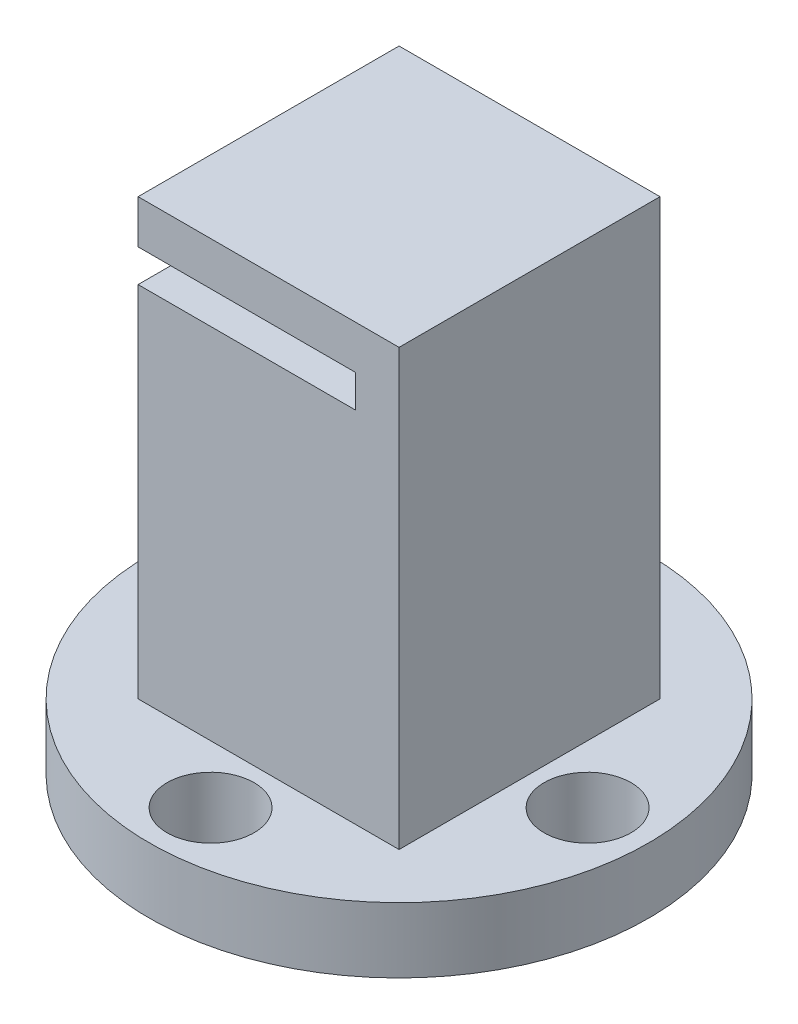
ISO-10303-21;
HEADER;
FILE_DESCRIPTION(('STEP AP214'),'2;1');
FILE_NAME('part.step','',(''),(''),'','','');
FILE_SCHEMA(('AUTOMOTIVE_DESIGN { 1 0 10303 214 1 1 1 1 }'));
ENDSEC;
DATA;
#1=APPLICATION_CONTEXT('core data for automotive mechanical design processes');
#2=APPLICATION_PROTOCOL_DEFINITION('international standard','automotive_design',2000,#1);
#3=PRODUCT_CONTEXT('',#1,'mechanical');
#4=PRODUCT('Part','Part','',(#3));
#5=PRODUCT_RELATED_PRODUCT_CATEGORY('part','',(#4));
#6=PRODUCT_DEFINITION_FORMATION('','',#4);
#7=PRODUCT_DEFINITION_CONTEXT('part definition',#1,'design');
#8=PRODUCT_DEFINITION('design','',#6,#7);
#9=PRODUCT_DEFINITION_SHAPE('','',#8);
#10=(LENGTH_UNIT() NAMED_UNIT(*) SI_UNIT(.MILLI.,.METRE.));
#11=(NAMED_UNIT(*) PLANE_ANGLE_UNIT() SI_UNIT($,.RADIAN.));
#12=(NAMED_UNIT(*) SI_UNIT($,.STERADIAN.) SOLID_ANGLE_UNIT());
#13=UNCERTAINTY_MEASURE_WITH_UNIT(LENGTH_MEASURE(1.E-05),#10,'distance_accuracy_value','');
#14=(GEOMETRIC_REPRESENTATION_CONTEXT(3) GLOBAL_UNCERTAINTY_ASSIGNED_CONTEXT((#13)) GLOBAL_UNIT_ASSIGNED_CONTEXT((#10,
#11,#12)) REPRESENTATION_CONTEXT('',''));
#15=CARTESIAN_POINT('',(0.,0.,0.));
#16=DIRECTION('',(0.,0.,1.));
#17=DIRECTION('',(1.,0.,0.));
#18=AXIS2_PLACEMENT_3D('',#15,#16,#17);
#19=CARTESIAN_POINT('',(0.,20.,0.));
#20=DIRECTION('',(1.,0.,0.));
#21=DIRECTION('',(0.,0.,-1.));
#22=AXIS2_PLACEMENT_3D('',#19,#20,#21);
#23=PLANE('',#22);
#24=DIRECTION('',(0.,-1.,0.));
#25=VECTOR('',#24,1.);
#26=CARTESIAN_POINT('',(0.,18.,-10.));
#27=LINE('',#26,#25);
#28=CARTESIAN_POINT('',(0.,18.,-10.));
#29=VERTEX_POINT('',#28);
#30=CARTESIAN_POINT('',(0.,16.5,-10.));
#31=VERTEX_POINT('',#30);
#32=EDGE_CURVE('E181',#29,#31,#27,.T.);
#33=ORIENTED_EDGE('',*,*,#32,.F.);
#34=DIRECTION('',(0.,0.,1.));
#35=VECTOR('',#34,1.);
#36=CARTESIAN_POINT('',(0.,18.,-10.));
#37=LINE('',#36,#35);
#38=CARTESIAN_POINT('',(0.,18.,0.));
#39=VERTEX_POINT('',#38);
#40=EDGE_CURVE('E87',#29,#39,#37,.T.);
#41=ORIENTED_EDGE('',*,*,#40,.T.);
#42=DIRECTION('',(0.,-1.,0.));
#43=VECTOR('',#42,1.);
#44=CARTESIAN_POINT('',(0.,20.,0.));
#45=LINE('',#44,#43);
#46=CARTESIAN_POINT('',(0.,20.,0.));
#47=VERTEX_POINT('',#46);
#48=EDGE_CURVE('E11',#47,#39,#45,.T.);
#49=ORIENTED_EDGE('',*,*,#48,.F.);
#50=DIRECTION('',(0.,0.,1.));
#51=VECTOR('',#50,1.);
#52=CARTESIAN_POINT('',(0.,20.,0.));
#53=LINE('',#52,#51);
#54=CARTESIAN_POINT('',(0.,20.,-12.));
#55=VERTEX_POINT('',#54);
#56=EDGE_CURVE('E111',#55,#47,#53,.T.);
#57=ORIENTED_EDGE('',*,*,#56,.F.);
#58=DIRECTION('',(0.,-1.,0.));
#59=VECTOR('',#58,1.);
#60=CARTESIAN_POINT('',(0.,20.,-12.));
#61=LINE('',#60,#59);
#62=CARTESIAN_POINT('',(0.,0.,-12.));
#63=VERTEX_POINT('',#62);
#64=EDGE_CURVE('E129',#55,#63,#61,.T.);
#65=ORIENTED_EDGE('',*,*,#64,.T.);
#66=DIRECTION('',(0.,0.,1.));
#67=VECTOR('',#66,1.);
#68=CARTESIAN_POINT('',(0.,0.,0.));
#69=LINE('',#68,#67);
#70=CARTESIAN_POINT('',(0.,0.,0.));
#71=VERTEX_POINT('',#70);
#72=EDGE_CURVE('E133',#63,#71,#69,.T.);
#73=ORIENTED_EDGE('',*,*,#72,.T.);
#74=CARTESIAN_POINT('',(0.,16.5,0.));
#75=VERTEX_POINT('',#74);
#76=EDGE_CURVE('E47',#75,#71,#45,.T.);
#77=ORIENTED_EDGE('',*,*,#76,.F.);
#78=DIRECTION('',(0.,0.,1.));
#79=VECTOR('',#78,1.);
#80=CARTESIAN_POINT('',(0.,16.5,-10.));
#81=LINE('',#80,#79);
#82=EDGE_CURVE('E54',#31,#75,#81,.T.);
#83=ORIENTED_EDGE('',*,*,#82,.F.);
#84=EDGE_LOOP('',(#33,#41,#49,#57,#65,#73,#77,#83));
#85=FACE_BOUND('',#84,.T.);
#86=ADVANCED_FACE('F39',(#85),#23,.F.);
#87=CARTESIAN_POINT('',(0.,20.,0.));
#88=DIRECTION('',(0.,0.,-1.));
#89=DIRECTION('',(-1.,0.,0.));
#90=AXIS2_PLACEMENT_3D('',#87,#88,#89);
#91=PLANE('',#90);
#92=ORIENTED_EDGE('',*,*,#48,.T.);
#93=DIRECTION('',(-1.,0.,0.));
#94=VECTOR('',#93,1.);
#95=CARTESIAN_POINT('',(0.,18.,0.));
#96=LINE('',#95,#94);
#97=CARTESIAN_POINT('',(10.,18.,0.));
#98=VERTEX_POINT('',#97);
#99=EDGE_CURVE('E185',#98,#39,#96,.T.);
#100=ORIENTED_EDGE('',*,*,#99,.F.);
#101=DIRECTION('',(0.,1.,0.));
#102=VECTOR('',#101,1.);
#103=CARTESIAN_POINT('',(10.,18.,0.));
#104=LINE('',#103,#102);
#105=CARTESIAN_POINT('',(10.,16.5,0.));
#106=VERTEX_POINT('',#105);
#107=EDGE_CURVE('E193',#106,#98,#104,.T.);
#108=ORIENTED_EDGE('',*,*,#107,.F.);
#109=DIRECTION('',(1.,0.,0.));
#110=VECTOR('',#109,1.);
#111=CARTESIAN_POINT('',(0.,16.5,0.));
#112=LINE('',#111,#110);
#113=EDGE_CURVE('E165',#75,#106,#112,.T.);
#114=ORIENTED_EDGE('',*,*,#113,.F.);
#115=ORIENTED_EDGE('',*,*,#76,.T.);
#116=DIRECTION('',(1.,0.,0.));
#117=VECTOR('',#116,1.);
#118=CARTESIAN_POINT('',(0.,0.,0.));
#119=LINE('',#118,#117);
#120=CARTESIAN_POINT('',(12.,0.,0.));
#121=VERTEX_POINT('',#120);
#122=EDGE_CURVE('E120',#71,#121,#119,.T.);
#123=ORIENTED_EDGE('',*,*,#122,.T.);
#124=DIRECTION('',(0.,-1.,0.));
#125=VECTOR('',#124,1.);
#126=CARTESIAN_POINT('',(12.,20.,0.));
#127=LINE('',#126,#125);
#128=CARTESIAN_POINT('',(12.,20.,0.));
#129=VERTEX_POINT('',#128);
#130=EDGE_CURVE('E117',#129,#121,#127,.T.);
#131=ORIENTED_EDGE('',*,*,#130,.F.);
#132=DIRECTION('',(1.,0.,0.));
#133=VECTOR('',#132,1.);
#134=CARTESIAN_POINT('',(0.,20.,0.));
#135=LINE('',#134,#133);
#136=EDGE_CURVE('E104',#47,#129,#135,.T.);
#137=ORIENTED_EDGE('',*,*,#136,.F.);
#138=EDGE_LOOP('',(#92,#100,#108,#114,#115,#123,#131,#137));
#139=FACE_BOUND('',#138,.T.);
#140=ADVANCED_FACE('F118',(#139),#91,.F.);
#141=CARTESIAN_POINT('',(12.,20.,0.));
#142=DIRECTION('',(-1.,0.,0.));
#143=DIRECTION('',(0.,0.,1.));
#144=AXIS2_PLACEMENT_3D('',#141,#142,#143);
#145=PLANE('',#144);
#146=DIRECTION('',(0.,0.,-1.));
#147=VECTOR('',#146,1.);
#148=CARTESIAN_POINT('',(12.,0.,0.));
#149=LINE('',#148,#147);
#150=CARTESIAN_POINT('',(12.,0.,-12.));
#151=VERTEX_POINT('',#150);
#152=EDGE_CURVE('E76',#121,#151,#149,.T.);
#153=ORIENTED_EDGE('',*,*,#152,.T.);
#154=DIRECTION('',(0.,-1.,0.));
#155=VECTOR('',#154,1.);
#156=CARTESIAN_POINT('',(12.,20.,-12.));
#157=LINE('',#156,#155);
#158=CARTESIAN_POINT('',(12.,20.,-12.));
#159=VERTEX_POINT('',#158);
#160=EDGE_CURVE('E123',#159,#151,#157,.T.);
#161=ORIENTED_EDGE('',*,*,#160,.F.);
#162=DIRECTION('',(0.,0.,-1.));
#163=VECTOR('',#162,1.);
#164=CARTESIAN_POINT('',(12.,20.,0.));
#165=LINE('',#164,#163);
#166=EDGE_CURVE('E108',#129,#159,#165,.T.);
#167=ORIENTED_EDGE('',*,*,#166,.F.);
#168=ORIENTED_EDGE('',*,*,#130,.T.);
#169=EDGE_LOOP('',(#153,#161,#167,#168));
#170=FACE_BOUND('',#169,.T.);
#171=ADVANCED_FACE('F124',(#170),#145,.F.);
#172=CARTESIAN_POINT('',(0.,20.,-12.));
#173=DIRECTION('',(0.,0.,1.));
#174=DIRECTION('',(1.,0.,0.));
#175=AXIS2_PLACEMENT_3D('',#172,#173,#174);
#176=PLANE('',#175);
#177=DIRECTION('',(-1.,0.,0.));
#178=VECTOR('',#177,1.);
#179=CARTESIAN_POINT('',(0.,0.,-12.));
#180=LINE('',#179,#178);
#181=EDGE_CURVE('E141',#151,#63,#180,.T.);
#182=ORIENTED_EDGE('',*,*,#181,.T.);
#183=ORIENTED_EDGE('',*,*,#64,.F.);
#184=DIRECTION('',(-1.,0.,0.));
#185=VECTOR('',#184,1.);
#186=CARTESIAN_POINT('',(0.,20.,-12.));
#187=LINE('',#186,#185);
#188=EDGE_CURVE('E63',#159,#55,#187,.T.);
#189=ORIENTED_EDGE('',*,*,#188,.F.);
#190=ORIENTED_EDGE('',*,*,#160,.T.);
#191=EDGE_LOOP('',(#182,#183,#189,#190));
#192=FACE_BOUND('',#191,.T.);
#193=ADVANCED_FACE('F151',(#192),#176,.F.);
#194=CARTESIAN_POINT('',(0.,20.,0.));
#195=DIRECTION('',(0.,-1.,0.));
#196=DIRECTION('',(0.,0.,-1.));
#197=AXIS2_PLACEMENT_3D('',#194,#195,#196);
#198=PLANE('',#197);
#199=ORIENTED_EDGE('',*,*,#56,.T.);
#200=ORIENTED_EDGE('',*,*,#136,.T.);
#201=ORIENTED_EDGE('',*,*,#166,.T.);
#202=ORIENTED_EDGE('',*,*,#188,.T.);
#203=EDGE_LOOP('',(#199,#200,#201,#202));
#204=FACE_BOUND('',#203,.T.);
#205=ADVANCED_FACE('F106',(#204),#198,.F.);
#206=CARTESIAN_POINT('',(0.,18.,-10.));
#207=DIRECTION('',(0.,1.,0.));
#208=DIRECTION('',(0.,0.,1.));
#209=AXIS2_PLACEMENT_3D('',#206,#207,#208);
#210=PLANE('',#209);
#211=ORIENTED_EDGE('',*,*,#99,.T.);
#212=ORIENTED_EDGE('',*,*,#40,.F.);
#213=DIRECTION('',(-1.,0.,0.));
#214=VECTOR('',#213,1.);
#215=CARTESIAN_POINT('',(0.,18.,-10.));
#216=LINE('',#215,#214);
#217=CARTESIAN_POINT('',(10.,18.,-10.));
#218=VERTEX_POINT('',#217);
#219=EDGE_CURVE('E177',#218,#29,#216,.T.);
#220=ORIENTED_EDGE('',*,*,#219,.F.);
#221=DIRECTION('',(0.,0.,1.));
#222=VECTOR('',#221,1.);
#223=CARTESIAN_POINT('',(10.,18.,-10.));
#224=LINE('',#223,#222);
#225=EDGE_CURVE('E170',#218,#98,#224,.T.);
#226=ORIENTED_EDGE('',*,*,#225,.T.);
#227=EDGE_LOOP('',(#211,#212,#220,#226));
#228=FACE_BOUND('',#227,.T.);
#229=ADVANCED_FACE('F205',(#228),#210,.F.);
#230=CARTESIAN_POINT('',(10.,18.,-10.));
#231=DIRECTION('',(1.,0.,0.));
#232=DIRECTION('',(0.,0.,-1.));
#233=AXIS2_PLACEMENT_3D('',#230,#231,#232);
#234=PLANE('',#233);
#235=ORIENTED_EDGE('',*,*,#107,.T.);
#236=ORIENTED_EDGE('',*,*,#225,.F.);
#237=DIRECTION('',(0.,1.,0.));
#238=VECTOR('',#237,1.);
#239=CARTESIAN_POINT('',(10.,18.,-10.));
#240=LINE('',#239,#238);
#241=CARTESIAN_POINT('',(10.,16.5,-10.));
#242=VERTEX_POINT('',#241);
#243=EDGE_CURVE('E173',#242,#218,#240,.T.);
#244=ORIENTED_EDGE('',*,*,#243,.F.);
#245=DIRECTION('',(0.,0.,1.));
#246=VECTOR('',#245,1.);
#247=CARTESIAN_POINT('',(10.,16.5,-10.));
#248=LINE('',#247,#246);
#249=EDGE_CURVE('E159',#242,#106,#248,.T.);
#250=ORIENTED_EDGE('',*,*,#249,.T.);
#251=EDGE_LOOP('',(#235,#236,#244,#250));
#252=FACE_BOUND('',#251,.T.);
#253=ADVANCED_FACE('F174',(#252),#234,.F.);
#254=CARTESIAN_POINT('',(0.,16.5,-10.));
#255=DIRECTION('',(0.,-1.,0.));
#256=DIRECTION('',(0.,0.,-1.));
#257=AXIS2_PLACEMENT_3D('',#254,#255,#256);
#258=PLANE('',#257);
#259=ORIENTED_EDGE('',*,*,#113,.T.);
#260=ORIENTED_EDGE('',*,*,#249,.F.);
#261=DIRECTION('',(1.,0.,0.));
#262=VECTOR('',#261,1.);
#263=CARTESIAN_POINT('',(0.,16.5,-10.));
#264=LINE('',#263,#262);
#265=EDGE_CURVE('E163',#31,#242,#264,.T.);
#266=ORIENTED_EDGE('',*,*,#265,.F.);
#267=ORIENTED_EDGE('',*,*,#82,.T.);
#268=EDGE_LOOP('',(#259,#260,#266,#267));
#269=FACE_BOUND('',#268,.T.);
#270=ADVANCED_FACE('F161',(#269),#258,.F.);
#271=CARTESIAN_POINT('',(0.,0.,-10.));
#272=DIRECTION('',(0.,0.,1.));
#273=DIRECTION('',(1.,0.,0.));
#274=AXIS2_PLACEMENT_3D('',#271,#272,#273);
#275=PLANE('',#274);
#276=ORIENTED_EDGE('',*,*,#32,.T.);
#277=ORIENTED_EDGE('',*,*,#265,.T.);
#278=ORIENTED_EDGE('',*,*,#243,.T.);
#279=ORIENTED_EDGE('',*,*,#219,.T.);
#280=EDGE_LOOP('',(#276,#277,#278,#279));
#281=FACE_BOUND('',#280,.T.);
#282=ADVANCED_FACE('F179',(#281),#275,.T.);
#283=CARTESIAN_POINT('',(6.,-3.,-6.));
#284=DIRECTION('',(0.,-1.,0.));
#285=DIRECTION('',(0.,0.,-1.));
#286=AXIS2_PLACEMENT_3D('',#283,#284,#285);
#287=PLANE('',#286);
#288=CARTESIAN_POINT('',(-2.66847448782835,-3.,-5.99999999999994));
#289=DIRECTION('',(0.,-1.,0.));
#290=DIRECTION('',(0.,0.,-1.));
#291=AXIS2_PLACEMENT_3D('',#288,#289,#290);
#292=CIRCLE('',#291,2.);
#293=CARTESIAN_POINT('',(-2.66847448782835,-3.,-7.99999999999994));
#294=VERTEX_POINT('',#293);
#295=EDGE_CURVE('E243',#294,#294,#292,.T.);
#296=ORIENTED_EDGE('',*,*,#295,.F.);
#297=EDGE_LOOP('',(#296));
#298=FACE_BOUND('',#297,.T.);
#299=CARTESIAN_POINT('',(14.6684744878283,-3.,-6.));
#300=DIRECTION('',(0.,-1.,0.));
#301=DIRECTION('',(0.,0.,-1.));
#302=AXIS2_PLACEMENT_3D('',#299,#300,#301);
#303=CIRCLE('',#302,2.);
#304=CARTESIAN_POINT('',(14.6684744878283,-3.,-8.));
#305=VERTEX_POINT('',#304);
#306=EDGE_CURVE('E255',#305,#305,#303,.T.);
#307=ORIENTED_EDGE('',*,*,#306,.F.);
#308=EDGE_LOOP('',(#307));
#309=FACE_BOUND('',#308,.T.);
#310=CARTESIAN_POINT('',(6.,-3.,-6.));
#311=DIRECTION('',(0.,-1.,0.));
#312=DIRECTION('',(0.,0.,-1.));
#313=AXIS2_PLACEMENT_3D('',#310,#311,#312);
#314=CIRCLE('',#313,11.4781788361966);
#315=CARTESIAN_POINT('',(6.,-3.,-17.4781788361966));
#316=VERTEX_POINT('',#315);
#317=EDGE_CURVE('E194',#316,#316,#314,.T.);
#318=ORIENTED_EDGE('',*,*,#317,.T.);
#319=EDGE_LOOP('',(#318));
#320=FACE_BOUND('',#319,.T.);
#321=CARTESIAN_POINT('',(5.99999999999997,-3.,-14.6684744878283));
#322=DIRECTION('',(0.,-1.,0.));
#323=DIRECTION('',(0.,0.,-1.));
#324=AXIS2_PLACEMENT_3D('',#321,#322,#323);
#325=CIRCLE('',#324,2.00000000000001);
#326=CARTESIAN_POINT('',(5.99999999999997,-3.,-16.6684744878284));
#327=VERTEX_POINT('',#326);
#328=EDGE_CURVE('E249',#327,#327,#325,.T.);
#329=ORIENTED_EDGE('',*,*,#328,.F.);
#330=EDGE_LOOP('',(#329));
#331=FACE_BOUND('',#330,.T.);
#332=CARTESIAN_POINT('',(6.00000000000009,-3.,2.66847448782835));
#333=DIRECTION('',(0.,-1.,0.));
#334=DIRECTION('',(0.,0.,-1.));
#335=AXIS2_PLACEMENT_3D('',#332,#333,#334);
#336=CIRCLE('',#335,2.);
#337=CARTESIAN_POINT('',(6.00000000000009,-3.,0.668474487828347));
#338=VERTEX_POINT('',#337);
#339=EDGE_CURVE('E237',#338,#338,#336,.T.);
#340=ORIENTED_EDGE('',*,*,#339,.F.);
#341=EDGE_LOOP('',(#340));
#342=FACE_BOUND('',#341,.T.);
#343=ADVANCED_FACE('F214',(#298,#309,#320,#331,#342),#287,.T.);
#344=CARTESIAN_POINT('',(6.,0.,-6.));
#345=DIRECTION('',(0.,-1.,0.));
#346=DIRECTION('',(0.,0.,-1.));
#347=AXIS2_PLACEMENT_3D('',#344,#345,#346);
#348=PLANE('',#347);
#349=ORIENTED_EDGE('',*,*,#72,.F.);
#350=ORIENTED_EDGE('',*,*,#181,.F.);
#351=ORIENTED_EDGE('',*,*,#152,.F.);
#352=ORIENTED_EDGE('',*,*,#122,.F.);
#353=EDGE_LOOP('',(#349,#350,#351,#352));
#354=FACE_BOUND('',#353,.T.);
#355=CARTESIAN_POINT('',(6.,0.,-6.));
#356=DIRECTION('',(0.,-1.,0.));
#357=DIRECTION('',(0.,0.,-1.));
#358=AXIS2_PLACEMENT_3D('',#355,#356,#357);
#359=CIRCLE('',#358,11.4781788361966);
#360=CARTESIAN_POINT('',(6.,0.,-17.4781788361966));
#361=VERTEX_POINT('',#360);
#362=EDGE_CURVE('E219',#361,#361,#359,.T.);
#363=ORIENTED_EDGE('',*,*,#362,.F.);
#364=EDGE_LOOP('',(#363));
#365=FACE_BOUND('',#364,.T.);
#366=CARTESIAN_POINT('',(14.6684744878283,0.,-6.));
#367=DIRECTION('',(0.,-1.,0.));
#368=DIRECTION('',(0.,0.,-1.));
#369=AXIS2_PLACEMENT_3D('',#366,#367,#368);
#370=CIRCLE('',#369,2.);
#371=CARTESIAN_POINT('',(14.6684744878283,0.,-8.));
#372=VERTEX_POINT('',#371);
#373=EDGE_CURVE('E223',#372,#372,#370,.T.);
#374=ORIENTED_EDGE('',*,*,#373,.T.);
#375=EDGE_LOOP('',(#374));
#376=FACE_BOUND('',#375,.T.);
#377=CARTESIAN_POINT('',(5.99999999999997,0.,-14.6684744878283));
#378=DIRECTION('',(0.,-1.,0.));
#379=DIRECTION('',(0.,0.,-1.));
#380=AXIS2_PLACEMENT_3D('',#377,#378,#379);
#381=CIRCLE('',#380,2.00000000000001);
#382=CARTESIAN_POINT('',(5.99999999999997,0.,-16.6684744878284));
#383=VERTEX_POINT('',#382);
#384=EDGE_CURVE('E227',#383,#383,#381,.T.);
#385=ORIENTED_EDGE('',*,*,#384,.T.);
#386=EDGE_LOOP('',(#385));
#387=FACE_BOUND('',#386,.T.);
#388=CARTESIAN_POINT('',(-2.66847448782835,0.,-5.99999999999994));
#389=DIRECTION('',(0.,-1.,0.));
#390=DIRECTION('',(0.,0.,-1.));
#391=AXIS2_PLACEMENT_3D('',#388,#389,#390);
#392=CIRCLE('',#391,2.);
#393=CARTESIAN_POINT('',(-2.66847448782835,0.,-7.99999999999994));
#394=VERTEX_POINT('',#393);
#395=EDGE_CURVE('E231',#394,#394,#392,.T.);
#396=ORIENTED_EDGE('',*,*,#395,.T.);
#397=EDGE_LOOP('',(#396));
#398=FACE_BOUND('',#397,.T.);
#399=CARTESIAN_POINT('',(6.00000000000009,0.,2.66847448782835));
#400=DIRECTION('',(0.,-1.,0.));
#401=DIRECTION('',(0.,0.,-1.));
#402=AXIS2_PLACEMENT_3D('',#399,#400,#401);
#403=CIRCLE('',#402,2.);
#404=CARTESIAN_POINT('',(6.00000000000009,0.,0.668474487828347));
#405=VERTEX_POINT('',#404);
#406=EDGE_CURVE('E234',#405,#405,#403,.T.);
#407=ORIENTED_EDGE('',*,*,#406,.T.);
#408=EDGE_LOOP('',(#407));
#409=FACE_BOUND('',#408,.T.);
#410=ADVANCED_FACE('F210',(#354,#365,#376,#387,#398,#409),#348,.F.);
#411=CARTESIAN_POINT('',(6.,-3.,-6.));
#412=DIRECTION('',(0.,1.,0.));
#413=DIRECTION('',(0.,0.,1.));
#414=AXIS2_PLACEMENT_3D('',#411,#412,#413);
#415=CYLINDRICAL_SURFACE('',#414,11.4781788361966);
#416=ORIENTED_EDGE('',*,*,#317,.F.);
#417=EDGE_LOOP('',(#416));
#418=FACE_BOUND('',#417,.T.);
#419=ORIENTED_EDGE('',*,*,#362,.T.);
#420=EDGE_LOOP('',(#419));
#421=FACE_BOUND('',#420,.T.);
#422=ADVANCED_FACE('F213',(#418,#421),#415,.T.);
#423=CARTESIAN_POINT('',(14.6684744878283,-3.,-6.));
#424=DIRECTION('',(0.,1.,0.));
#425=DIRECTION('',(0.,0.,1.));
#426=AXIS2_PLACEMENT_3D('',#423,#424,#425);
#427=CYLINDRICAL_SURFACE('',#426,2.);
#428=ORIENTED_EDGE('',*,*,#306,.T.);
#429=EDGE_LOOP('',(#428));
#430=FACE_BOUND('',#429,.T.);
#431=ORIENTED_EDGE('',*,*,#373,.F.);
#432=EDGE_LOOP('',(#431));
#433=FACE_BOUND('',#432,.T.);
#434=ADVANCED_FACE('F266',(#430,#433),#427,.F.);
#435=CARTESIAN_POINT('',(5.99999999999997,-3.,-14.6684744878283));
#436=DIRECTION('',(0.,1.,0.));
#437=DIRECTION('',(0.,0.,1.));
#438=AXIS2_PLACEMENT_3D('',#435,#436,#437);
#439=CYLINDRICAL_SURFACE('',#438,2.00000000000001);
#440=ORIENTED_EDGE('',*,*,#328,.T.);
#441=EDGE_LOOP('',(#440));
#442=FACE_BOUND('',#441,.T.);
#443=ORIENTED_EDGE('',*,*,#384,.F.);
#444=EDGE_LOOP('',(#443));
#445=FACE_BOUND('',#444,.T.);
#446=ADVANCED_FACE('F272',(#442,#445),#439,.F.);
#447=CARTESIAN_POINT('',(-2.66847448782835,-3.,-5.99999999999994));
#448=DIRECTION('',(0.,1.,0.));
#449=DIRECTION('',(0.,0.,1.));
#450=AXIS2_PLACEMENT_3D('',#447,#448,#449);
#451=CYLINDRICAL_SURFACE('',#450,2.);
#452=ORIENTED_EDGE('',*,*,#295,.T.);
#453=EDGE_LOOP('',(#452));
#454=FACE_BOUND('',#453,.T.);
#455=ORIENTED_EDGE('',*,*,#395,.F.);
#456=EDGE_LOOP('',(#455));
#457=FACE_BOUND('',#456,.T.);
#458=ADVANCED_FACE('F308',(#454,#457),#451,.F.);
#459=CARTESIAN_POINT('',(6.00000000000009,-3.,2.66847448782835));
#460=DIRECTION('',(0.,1.,0.));
#461=DIRECTION('',(0.,0.,1.));
#462=AXIS2_PLACEMENT_3D('',#459,#460,#461);
#463=CYLINDRICAL_SURFACE('',#462,2.);
#464=ORIENTED_EDGE('',*,*,#339,.T.);
#465=EDGE_LOOP('',(#464));
#466=FACE_BOUND('',#465,.T.);
#467=ORIENTED_EDGE('',*,*,#406,.F.);
#468=EDGE_LOOP('',(#467));
#469=FACE_BOUND('',#468,.T.);
#470=ADVANCED_FACE('F312',(#466,#469),#463,.F.);
#471=CLOSED_SHELL('',(#86,#140,#171,#193,#205,#229,#253,#270,#282,#343,#410,#422,#434,#446,#458,#470));
#472=MANIFOLD_SOLID_BREP('B2',#471);
#473=ADVANCED_BREP_SHAPE_REPRESENTATION('',(#18,#472),#14);
#474=SHAPE_DEFINITION_REPRESENTATION(#9,#473);
ENDSEC;
END-ISO-10303-21;
